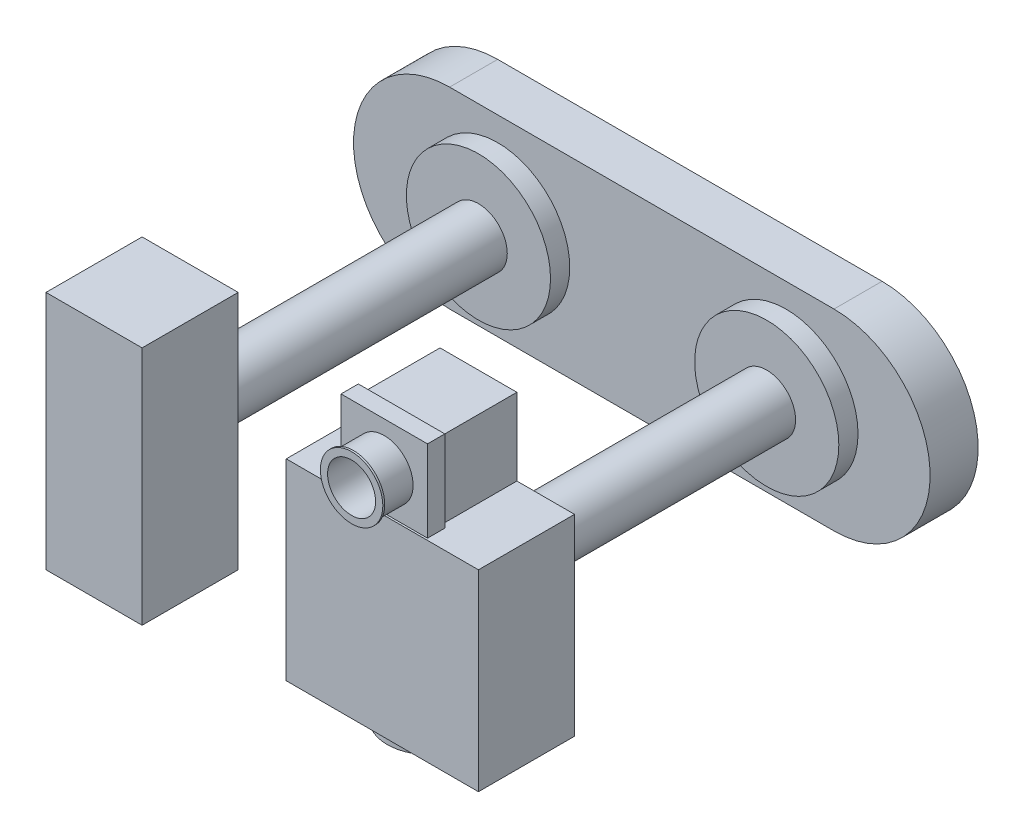
ISO-10303-21;
HEADER;
FILE_DESCRIPTION(('STEP AP214'),'2;1');
FILE_NAME('part.step','',(''),(''),'','','');
FILE_SCHEMA(('AUTOMOTIVE_DESIGN { 1 0 10303 214 1 1 1 1 }'));
ENDSEC;
DATA;
#1=APPLICATION_CONTEXT('core data for automotive mechanical design processes');
#2=APPLICATION_PROTOCOL_DEFINITION('international standard','automotive_design',2000,#1);
#3=PRODUCT_CONTEXT('',#1,'mechanical');
#4=PRODUCT('Part','Part','',(#3));
#5=PRODUCT_RELATED_PRODUCT_CATEGORY('part','',(#4));
#6=PRODUCT_DEFINITION_FORMATION('','',#4);
#7=PRODUCT_DEFINITION_CONTEXT('part definition',#1,'design');
#8=PRODUCT_DEFINITION('design','',#6,#7);
#9=PRODUCT_DEFINITION_SHAPE('','',#8);
#10=(LENGTH_UNIT() NAMED_UNIT(*) SI_UNIT(.MILLI.,.METRE.));
#11=(NAMED_UNIT(*) PLANE_ANGLE_UNIT() SI_UNIT($,.RADIAN.));
#12=(NAMED_UNIT(*) SI_UNIT($,.STERADIAN.) SOLID_ANGLE_UNIT());
#13=UNCERTAINTY_MEASURE_WITH_UNIT(LENGTH_MEASURE(1.E-05),#10,'distance_accuracy_value','');
#14=(GEOMETRIC_REPRESENTATION_CONTEXT(3) GLOBAL_UNCERTAINTY_ASSIGNED_CONTEXT((#13)) GLOBAL_UNIT_ASSIGNED_CONTEXT((#10,
#11,#12)) REPRESENTATION_CONTEXT('',''));
#15=CARTESIAN_POINT('',(0.,0.,0.));
#16=DIRECTION('',(0.,0.,1.));
#17=DIRECTION('',(1.,0.,0.));
#18=AXIS2_PLACEMENT_3D('',#15,#16,#17);
#19=CARTESIAN_POINT('',(75.,50.,235.));
#20=DIRECTION('',(0.,-1.,0.));
#21=DIRECTION('',(0.,0.,-1.));
#22=AXIS2_PLACEMENT_3D('',#19,#20,#21);
#23=PLANE('',#22);
#24=DIRECTION('',(0.,0.,-1.));
#25=VECTOR('',#24,1.);
#26=CARTESIAN_POINT('',(52.5,50.,234.));
#27=LINE('',#26,#25);
#28=CARTESIAN_POINT('',(52.5,50.,234.));
#29=VERTEX_POINT('',#28);
#30=CARTESIAN_POINT('',(52.5,50.,225.));
#31=VERTEX_POINT('',#30);
#32=EDGE_CURVE('E11',#29,#31,#27,.T.);
#33=ORIENTED_EDGE('',*,*,#32,.T.);
#34=DIRECTION('',(1.,0.,0.));
#35=VECTOR('',#34,1.);
#36=CARTESIAN_POINT('',(75.,50.,225.));
#37=LINE('',#36,#35);
#38=CARTESIAN_POINT('',(55.,50.,225.));
#39=VERTEX_POINT('',#38);
#40=EDGE_CURVE('E24',#31,#39,#37,.T.);
#41=ORIENTED_EDGE('',*,*,#40,.T.);
#42=DIRECTION('',(0.,0.,-1.));
#43=VECTOR('',#42,1.);
#44=CARTESIAN_POINT('',(55.,50.,225.));
#45=LINE('',#44,#43);
#46=CARTESIAN_POINT('',(55.,50.,185.));
#47=VERTEX_POINT('',#46);
#48=EDGE_CURVE('E352',#39,#47,#45,.T.);
#49=ORIENTED_EDGE('',*,*,#48,.T.);
#50=DIRECTION('',(-1.,0.,0.));
#51=VECTOR('',#50,1.);
#52=CARTESIAN_POINT('',(75.,50.,185.));
#53=LINE('',#52,#51);
#54=CARTESIAN_POINT('',(25.,50.,185.));
#55=VERTEX_POINT('',#54);
#56=EDGE_CURVE('E350',#47,#55,#53,.T.);
#57=ORIENTED_EDGE('',*,*,#56,.T.);
#58=DIRECTION('',(0.,0.,-1.));
#59=VECTOR('',#58,1.);
#60=CARTESIAN_POINT('',(25.,50.,235.));
#61=LINE('',#60,#59);
#62=CARTESIAN_POINT('',(25.,50.,235.));
#63=VERTEX_POINT('',#62);
#64=EDGE_CURVE('E347',#63,#55,#61,.T.);
#65=ORIENTED_EDGE('',*,*,#64,.F.);
#66=DIRECTION('',(-1.,0.,0.));
#67=VECTOR('',#66,1.);
#68=CARTESIAN_POINT('',(75.,50.,235.));
#69=LINE('',#68,#67);
#70=CARTESIAN_POINT('',(125.,50.,235.));
#71=VERTEX_POINT('',#70);
#72=EDGE_CURVE('E344',#71,#63,#69,.T.);
#73=ORIENTED_EDGE('',*,*,#72,.F.);
#74=DIRECTION('',(0.,0.,-1.));
#75=VECTOR('',#74,1.);
#76=CARTESIAN_POINT('',(125.,50.,235.));
#77=LINE('',#76,#75);
#78=CARTESIAN_POINT('',(125.,50.,185.));
#79=VERTEX_POINT('',#78);
#80=EDGE_CURVE('E342',#71,#79,#77,.T.);
#81=ORIENTED_EDGE('',*,*,#80,.T.);
#82=CARTESIAN_POINT('',(95.,50.,185.));
#83=VERTEX_POINT('',#82);
#84=EDGE_CURVE('E341',#79,#83,#53,.T.);
#85=ORIENTED_EDGE('',*,*,#84,.T.);
#86=DIRECTION('',(0.,0.,-1.));
#87=VECTOR('',#86,1.);
#88=CARTESIAN_POINT('',(95.,50.,225.));
#89=LINE('',#88,#87);
#90=CARTESIAN_POINT('',(95.,50.,225.));
#91=VERTEX_POINT('',#90);
#92=EDGE_CURVE('E338',#91,#83,#89,.T.);
#93=ORIENTED_EDGE('',*,*,#92,.F.);
#94=CARTESIAN_POINT('',(97.5,50.,225.));
#95=VERTEX_POINT('',#94);
#96=EDGE_CURVE('E337',#91,#95,#37,.T.);
#97=ORIENTED_EDGE('',*,*,#96,.T.);
#98=DIRECTION('',(0.,0.,-1.));
#99=VECTOR('',#98,1.);
#100=CARTESIAN_POINT('',(97.5,50.,234.));
#101=LINE('',#100,#99);
#102=CARTESIAN_POINT('',(97.5,50.,234.));
#103=VERTEX_POINT('',#102);
#104=EDGE_CURVE('E335',#103,#95,#101,.T.);
#105=ORIENTED_EDGE('',*,*,#104,.F.);
#106=DIRECTION('',(1.,0.,0.));
#107=VECTOR('',#106,1.);
#108=CARTESIAN_POINT('',(75.,50.,234.));
#109=LINE('',#108,#107);
#110=EDGE_CURVE('E174',#29,#103,#109,.T.);
#111=ORIENTED_EDGE('',*,*,#110,.F.);
#112=EDGE_LOOP('',(#33,#41,#49,#57,#65,#73,#81,#85,#93,#97,#105,#111));
#113=FACE_BOUND('',#112,.T.);
#114=ADVANCED_FACE('F17',(#113),#23,.F.);
#115=CARTESIAN_POINT('',(0.,50.,25.));
#116=DIRECTION('',(0.,1.,0.));
#117=DIRECTION('',(0.,0.,1.));
#118=AXIS2_PLACEMENT_3D('',#115,#116,#117);
#119=PLANE('',#118);
#120=DIRECTION('',(1.,0.,0.));
#121=VECTOR('',#120,1.);
#122=CARTESIAN_POINT('',(0.,50.,0.));
#123=LINE('',#122,#121);
#124=CARTESIAN_POINT('',(-100.,50.,0.));
#125=VERTEX_POINT('',#124);
#126=CARTESIAN_POINT('',(100.,50.,0.));
#127=VERTEX_POINT('',#126);
#128=EDGE_CURVE('E331',#125,#127,#123,.T.);
#129=ORIENTED_EDGE('',*,*,#128,.F.);
#130=DIRECTION('',(0.,0.,-1.));
#131=VECTOR('',#130,1.);
#132=CARTESIAN_POINT('',(-100.,50.,25.));
#133=LINE('',#132,#131);
#134=CARTESIAN_POINT('',(-100.,50.,25.));
#135=VERTEX_POINT('',#134);
#136=EDGE_CURVE('E328',#135,#125,#133,.T.);
#137=ORIENTED_EDGE('',*,*,#136,.F.);
#138=DIRECTION('',(1.,0.,0.));
#139=VECTOR('',#138,1.);
#140=CARTESIAN_POINT('',(0.,50.,25.));
#141=LINE('',#140,#139);
#142=CARTESIAN_POINT('',(100.,50.,25.));
#143=VERTEX_POINT('',#142);
#144=EDGE_CURVE('E326',#135,#143,#141,.T.);
#145=ORIENTED_EDGE('',*,*,#144,.T.);
#146=DIRECTION('',(0.,0.,-1.));
#147=VECTOR('',#146,1.);
#148=CARTESIAN_POINT('',(100.,50.,25.));
#149=LINE('',#148,#147);
#150=EDGE_CURVE('E324',#143,#127,#149,.T.);
#151=ORIENTED_EDGE('',*,*,#150,.T.);
#152=EDGE_LOOP('',(#129,#137,#145,#151));
#153=FACE_BOUND('',#152,.T.);
#154=ADVANCED_FACE('F373',(#153),#119,.T.);
#155=CARTESIAN_POINT('',(-100.,0.,25.));
#156=DIRECTION('',(0.,0.,-1.));
#157=DIRECTION('',(-1.,0.,0.));
#158=AXIS2_PLACEMENT_3D('',#155,#156,#157);
#159=CYLINDRICAL_SURFACE('',#158,50.);
#160=CARTESIAN_POINT('',(-100.,0.,0.));
#161=DIRECTION('',(0.,0.,1.));
#162=DIRECTION('',(1.,0.,0.));
#163=AXIS2_PLACEMENT_3D('',#160,#161,#162);
#164=CIRCLE('',#163,50.);
#165=CARTESIAN_POINT('',(-100.,-50.,0.));
#166=VERTEX_POINT('',#165);
#167=EDGE_CURVE('E322',#125,#166,#164,.T.);
#168=ORIENTED_EDGE('',*,*,#167,.T.);
#169=DIRECTION('',(0.,0.,-1.));
#170=VECTOR('',#169,1.);
#171=CARTESIAN_POINT('',(-100.,-50.,25.));
#172=LINE('',#171,#170);
#173=CARTESIAN_POINT('',(-100.,-50.,25.));
#174=VERTEX_POINT('',#173);
#175=EDGE_CURVE('E319',#174,#166,#172,.T.);
#176=ORIENTED_EDGE('',*,*,#175,.F.);
#177=CARTESIAN_POINT('',(-100.,0.,25.));
#178=DIRECTION('',(0.,0.,1.));
#179=DIRECTION('',(1.,0.,0.));
#180=AXIS2_PLACEMENT_3D('',#177,#178,#179);
#181=CIRCLE('',#180,50.);
#182=EDGE_CURVE('E316',#135,#174,#181,.T.);
#183=ORIENTED_EDGE('',*,*,#182,.F.);
#184=ORIENTED_EDGE('',*,*,#136,.T.);
#185=EDGE_LOOP('',(#168,#176,#183,#184));
#186=FACE_BOUND('',#185,.T.);
#187=ADVANCED_FACE('F377',(#186),#159,.T.);
#188=CARTESIAN_POINT('',(0.,-50.,25.));
#189=DIRECTION('',(0.,1.,0.));
#190=DIRECTION('',(0.,0.,1.));
#191=AXIS2_PLACEMENT_3D('',#188,#189,#190);
#192=PLANE('',#191);
#193=DIRECTION('',(1.,0.,0.));
#194=VECTOR('',#193,1.);
#195=CARTESIAN_POINT('',(0.,-50.,0.));
#196=LINE('',#195,#194);
#197=CARTESIAN_POINT('',(100.,-50.,0.));
#198=VERTEX_POINT('',#197);
#199=EDGE_CURVE('E314',#166,#198,#196,.T.);
#200=ORIENTED_EDGE('',*,*,#199,.T.);
#201=DIRECTION('',(0.,0.,-1.));
#202=VECTOR('',#201,1.);
#203=CARTESIAN_POINT('',(100.,-50.,25.));
#204=LINE('',#203,#202);
#205=CARTESIAN_POINT('',(100.,-50.,25.));
#206=VERTEX_POINT('',#205);
#207=EDGE_CURVE('E311',#206,#198,#204,.T.);
#208=ORIENTED_EDGE('',*,*,#207,.F.);
#209=DIRECTION('',(1.,0.,0.));
#210=VECTOR('',#209,1.);
#211=CARTESIAN_POINT('',(0.,-50.,25.));
#212=LINE('',#211,#210);
#213=EDGE_CURVE('E308',#174,#206,#212,.T.);
#214=ORIENTED_EDGE('',*,*,#213,.F.);
#215=ORIENTED_EDGE('',*,*,#175,.T.);
#216=EDGE_LOOP('',(#200,#208,#214,#215));
#217=FACE_BOUND('',#216,.T.);
#218=ADVANCED_FACE('F382',(#217),#192,.F.);
#219=CARTESIAN_POINT('',(100.,0.,25.));
#220=DIRECTION('',(0.,0.,-1.));
#221=DIRECTION('',(-1.,0.,0.));
#222=AXIS2_PLACEMENT_3D('',#219,#220,#221);
#223=CYLINDRICAL_SURFACE('',#222,50.);
#224=CARTESIAN_POINT('',(100.,0.,0.));
#225=DIRECTION('',(0.,0.,1.));
#226=DIRECTION('',(1.,0.,0.));
#227=AXIS2_PLACEMENT_3D('',#224,#225,#226);
#228=CIRCLE('',#227,50.);
#229=EDGE_CURVE('E305',#198,#127,#228,.T.);
#230=ORIENTED_EDGE('',*,*,#229,.T.);
#231=ORIENTED_EDGE('',*,*,#150,.F.);
#232=CARTESIAN_POINT('',(100.,0.,25.));
#233=DIRECTION('',(0.,0.,1.));
#234=DIRECTION('',(1.,0.,0.));
#235=AXIS2_PLACEMENT_3D('',#232,#233,#234);
#236=CIRCLE('',#235,50.);
#237=EDGE_CURVE('E302',#206,#143,#236,.T.);
#238=ORIENTED_EDGE('',*,*,#237,.F.);
#239=ORIENTED_EDGE('',*,*,#207,.T.);
#240=EDGE_LOOP('',(#230,#231,#238,#239));
#241=FACE_BOUND('',#240,.T.);
#242=ADVANCED_FACE('F388',(#241),#223,.T.);
#243=CARTESIAN_POINT('',(0.,0.,25.));
#244=DIRECTION('',(0.,0.,1.));
#245=DIRECTION('',(1.,0.,0.));
#246=AXIS2_PLACEMENT_3D('',#243,#244,#245);
#247=PLANE('',#246);
#248=CARTESIAN_POINT('',(75.,0.,25.));
#249=DIRECTION('',(0.,0.,1.));
#250=DIRECTION('',(1.,0.,0.));
#251=AXIS2_PLACEMENT_3D('',#248,#249,#250);
#252=CIRCLE('',#251,37.5);
#253=CARTESIAN_POINT('',(112.5,0.,25.));
#254=VERTEX_POINT('',#253);
#255=EDGE_CURVE('E299',#254,#254,#252,.T.);
#256=ORIENTED_EDGE('',*,*,#255,.F.);
#257=EDGE_LOOP('',(#256));
#258=FACE_BOUND('',#257,.T.);
#259=CARTESIAN_POINT('',(-75.,0.,25.));
#260=DIRECTION('',(0.,0.,1.));
#261=DIRECTION('',(1.,0.,0.));
#262=AXIS2_PLACEMENT_3D('',#259,#260,#261);
#263=CIRCLE('',#262,37.5);
#264=CARTESIAN_POINT('',(-37.5,0.,25.));
#265=VERTEX_POINT('',#264);
#266=EDGE_CURVE('E296',#265,#265,#263,.T.);
#267=ORIENTED_EDGE('',*,*,#266,.F.);
#268=EDGE_LOOP('',(#267));
#269=FACE_BOUND('',#268,.T.);
#270=ORIENTED_EDGE('',*,*,#144,.F.);
#271=ORIENTED_EDGE('',*,*,#182,.T.);
#272=ORIENTED_EDGE('',*,*,#213,.T.);
#273=ORIENTED_EDGE('',*,*,#237,.T.);
#274=EDGE_LOOP('',(#270,#271,#272,#273));
#275=FACE_BOUND('',#274,.T.);
#276=ADVANCED_FACE('F392',(#258,#269,#275),#247,.T.);
#277=CARTESIAN_POINT('',(0.,0.,0.));
#278=DIRECTION('',(0.,0.,1.));
#279=DIRECTION('',(1.,0.,0.));
#280=AXIS2_PLACEMENT_3D('',#277,#278,#279);
#281=PLANE('',#280);
#282=ORIENTED_EDGE('',*,*,#128,.T.);
#283=ORIENTED_EDGE('',*,*,#229,.F.);
#284=ORIENTED_EDGE('',*,*,#199,.F.);
#285=ORIENTED_EDGE('',*,*,#167,.F.);
#286=EDGE_LOOP('',(#282,#283,#284,#285));
#287=FACE_BOUND('',#286,.T.);
#288=ADVANCED_FACE('F396',(#287),#281,.F.);
#289=CARTESIAN_POINT('',(-75.,0.,35.));
#290=DIRECTION('',(0.,0.,-1.));
#291=DIRECTION('',(-1.,0.,0.));
#292=AXIS2_PLACEMENT_3D('',#289,#290,#291);
#293=CYLINDRICAL_SURFACE('',#292,37.5);
#294=CARTESIAN_POINT('',(-75.,0.,35.));
#295=DIRECTION('',(0.,0.,1.));
#296=DIRECTION('',(1.,0.,0.));
#297=AXIS2_PLACEMENT_3D('',#294,#295,#296);
#298=CIRCLE('',#297,37.5);
#299=CARTESIAN_POINT('',(-37.5,0.,35.));
#300=VERTEX_POINT('',#299);
#301=EDGE_CURVE('E293',#300,#300,#298,.T.);
#302=ORIENTED_EDGE('',*,*,#301,.F.);
#303=EDGE_LOOP('',(#302));
#304=FACE_BOUND('',#303,.T.);
#305=ORIENTED_EDGE('',*,*,#266,.T.);
#306=EDGE_LOOP('',(#305));
#307=FACE_BOUND('',#306,.T.);
#308=ADVANCED_FACE('F400',(#304,#307),#293,.T.);
#309=CARTESIAN_POINT('',(0.,0.,35.));
#310=DIRECTION('',(0.,0.,1.));
#311=DIRECTION('',(1.,0.,0.));
#312=AXIS2_PLACEMENT_3D('',#309,#310,#311);
#313=PLANE('',#312);
#314=CARTESIAN_POINT('',(-75.,0.,35.));
#315=DIRECTION('',(0.,0.,1.));
#316=DIRECTION('',(1.,0.,0.));
#317=AXIS2_PLACEMENT_3D('',#314,#315,#316);
#318=CIRCLE('',#317,15.);
#319=CARTESIAN_POINT('',(-60.,0.,35.));
#320=VERTEX_POINT('',#319);
#321=EDGE_CURVE('E290',#320,#320,#318,.T.);
#322=ORIENTED_EDGE('',*,*,#321,.F.);
#323=EDGE_LOOP('',(#322));
#324=FACE_BOUND('',#323,.T.);
#325=ORIENTED_EDGE('',*,*,#301,.T.);
#326=EDGE_LOOP('',(#325));
#327=FACE_BOUND('',#326,.T.);
#328=ADVANCED_FACE('F404',(#324,#327),#313,.T.);
#329=CARTESIAN_POINT('',(75.,0.,35.));
#330=DIRECTION('',(0.,0.,-1.));
#331=DIRECTION('',(-1.,0.,0.));
#332=AXIS2_PLACEMENT_3D('',#329,#330,#331);
#333=CYLINDRICAL_SURFACE('',#332,37.5);
#334=CARTESIAN_POINT('',(75.,0.,35.));
#335=DIRECTION('',(0.,0.,1.));
#336=DIRECTION('',(1.,0.,0.));
#337=AXIS2_PLACEMENT_3D('',#334,#335,#336);
#338=CIRCLE('',#337,37.5);
#339=CARTESIAN_POINT('',(112.5,0.,35.));
#340=VERTEX_POINT('',#339);
#341=EDGE_CURVE('E287',#340,#340,#338,.T.);
#342=ORIENTED_EDGE('',*,*,#341,.F.);
#343=EDGE_LOOP('',(#342));
#344=FACE_BOUND('',#343,.T.);
#345=ORIENTED_EDGE('',*,*,#255,.T.);
#346=EDGE_LOOP('',(#345));
#347=FACE_BOUND('',#346,.T.);
#348=ADVANCED_FACE('F408',(#344,#347),#333,.T.);
#349=CARTESIAN_POINT('',(0.,0.,35.));
#350=DIRECTION('',(0.,0.,1.));
#351=DIRECTION('',(1.,0.,0.));
#352=AXIS2_PLACEMENT_3D('',#349,#350,#351);
#353=PLANE('',#352);
#354=CARTESIAN_POINT('',(75.,0.,35.));
#355=DIRECTION('',(0.,0.,1.));
#356=DIRECTION('',(1.,0.,0.));
#357=AXIS2_PLACEMENT_3D('',#354,#355,#356);
#358=CIRCLE('',#357,15.);
#359=CARTESIAN_POINT('',(90.,0.,35.));
#360=VERTEX_POINT('',#359);
#361=EDGE_CURVE('E284',#360,#360,#358,.T.);
#362=ORIENTED_EDGE('',*,*,#361,.F.);
#363=EDGE_LOOP('',(#362));
#364=FACE_BOUND('',#363,.T.);
#365=ORIENTED_EDGE('',*,*,#341,.T.);
#366=EDGE_LOOP('',(#365));
#367=FACE_BOUND('',#366,.T.);
#368=ADVANCED_FACE('F412',(#364,#367),#353,.T.);
#369=CARTESIAN_POINT('',(75.,0.,185.));
#370=DIRECTION('',(0.,0.,-1.));
#371=DIRECTION('',(-1.,0.,0.));
#372=AXIS2_PLACEMENT_3D('',#369,#370,#371);
#373=CYLINDRICAL_SURFACE('',#372,15.);
#374=CARTESIAN_POINT('',(75.,0.,185.));
#375=DIRECTION('',(0.,0.,1.));
#376=DIRECTION('',(1.,0.,0.));
#377=AXIS2_PLACEMENT_3D('',#374,#375,#376);
#378=CIRCLE('',#377,15.);
#379=CARTESIAN_POINT('',(90.,0.,185.));
#380=VERTEX_POINT('',#379);
#381=EDGE_CURVE('E281',#380,#380,#378,.T.);
#382=ORIENTED_EDGE('',*,*,#381,.F.);
#383=EDGE_LOOP('',(#382));
#384=FACE_BOUND('',#383,.T.);
#385=ORIENTED_EDGE('',*,*,#361,.T.);
#386=EDGE_LOOP('',(#385));
#387=FACE_BOUND('',#386,.T.);
#388=ADVANCED_FACE('F416',(#384,#387),#373,.T.);
#389=CARTESIAN_POINT('',(-75.,0.,185.));
#390=DIRECTION('',(0.,0.,-1.));
#391=DIRECTION('',(-1.,0.,0.));
#392=AXIS2_PLACEMENT_3D('',#389,#390,#391);
#393=CYLINDRICAL_SURFACE('',#392,15.);
#394=CARTESIAN_POINT('',(-75.,0.,185.));
#395=DIRECTION('',(0.,0.,1.));
#396=DIRECTION('',(1.,0.,0.));
#397=AXIS2_PLACEMENT_3D('',#394,#395,#396);
#398=CIRCLE('',#397,15.);
#399=CARTESIAN_POINT('',(-60.,0.,185.));
#400=VERTEX_POINT('',#399);
#401=EDGE_CURVE('E278',#400,#400,#398,.T.);
#402=ORIENTED_EDGE('',*,*,#401,.F.);
#403=EDGE_LOOP('',(#402));
#404=FACE_BOUND('',#403,.T.);
#405=ORIENTED_EDGE('',*,*,#321,.T.);
#406=EDGE_LOOP('',(#405));
#407=FACE_BOUND('',#406,.T.);
#408=ADVANCED_FACE('F420',(#404,#407),#393,.T.);
#409=CARTESIAN_POINT('',(-100.,0.,235.));
#410=DIRECTION('',(-1.,0.,0.));
#411=DIRECTION('',(0.,0.,1.));
#412=AXIS2_PLACEMENT_3D('',#409,#410,#411);
#413=PLANE('',#412);
#414=DIRECTION('',(0.,1.,0.));
#415=VECTOR('',#414,1.);
#416=CARTESIAN_POINT('',(-100.,0.,185.));
#417=LINE('',#416,#415);
#418=CARTESIAN_POINT('',(-100.,-62.5,185.));
#419=VERTEX_POINT('',#418);
#420=CARTESIAN_POINT('',(-100.,62.5,185.));
#421=VERTEX_POINT('',#420);
#422=EDGE_CURVE('E275',#419,#421,#417,.T.);
#423=ORIENTED_EDGE('',*,*,#422,.F.);
#424=DIRECTION('',(0.,0.,-1.));
#425=VECTOR('',#424,1.);
#426=CARTESIAN_POINT('',(-100.,-62.5,235.));
#427=LINE('',#426,#425);
#428=CARTESIAN_POINT('',(-100.,-62.5,235.));
#429=VERTEX_POINT('',#428);
#430=EDGE_CURVE('E272',#429,#419,#427,.T.);
#431=ORIENTED_EDGE('',*,*,#430,.F.);
#432=DIRECTION('',(0.,1.,0.));
#433=VECTOR('',#432,1.);
#434=CARTESIAN_POINT('',(-100.,0.,235.));
#435=LINE('',#434,#433);
#436=CARTESIAN_POINT('',(-100.,62.5,235.));
#437=VERTEX_POINT('',#436);
#438=EDGE_CURVE('E270',#429,#437,#435,.T.);
#439=ORIENTED_EDGE('',*,*,#438,.T.);
#440=DIRECTION('',(0.,0.,-1.));
#441=VECTOR('',#440,1.);
#442=CARTESIAN_POINT('',(-100.,62.5,235.));
#443=LINE('',#442,#441);
#444=EDGE_CURVE('E268',#437,#421,#443,.T.);
#445=ORIENTED_EDGE('',*,*,#444,.T.);
#446=EDGE_LOOP('',(#423,#431,#439,#445));
#447=FACE_BOUND('',#446,.T.);
#448=ADVANCED_FACE('F424',(#447),#413,.T.);
#449=CARTESIAN_POINT('',(-75.,-62.5,235.));
#450=DIRECTION('',(0.,1.,0.));
#451=DIRECTION('',(0.,0.,1.));
#452=AXIS2_PLACEMENT_3D('',#449,#450,#451);
#453=PLANE('',#452);
#454=CARTESIAN_POINT('',(-75.,-62.5,210.));
#455=DIRECTION('',(0.,-1.,0.));
#456=DIRECTION('',(0.,0.,-1.));
#457=AXIS2_PLACEMENT_3D('',#454,#455,#456);
#458=CIRCLE('',#457,15.);
#459=CARTESIAN_POINT('',(-75.,-62.5,195.));
#460=VERTEX_POINT('',#459);
#461=EDGE_CURVE('E265',#460,#460,#458,.T.);
#462=ORIENTED_EDGE('',*,*,#461,.F.);
#463=EDGE_LOOP('',(#462));
#464=FACE_BOUND('',#463,.T.);
#465=DIRECTION('',(1.,0.,0.));
#466=VECTOR('',#465,1.);
#467=CARTESIAN_POINT('',(-75.,-62.5,185.));
#468=LINE('',#467,#466);
#469=CARTESIAN_POINT('',(-50.,-62.5,185.));
#470=VERTEX_POINT('',#469);
#471=EDGE_CURVE('E263',#419,#470,#468,.T.);
#472=ORIENTED_EDGE('',*,*,#471,.T.);
#473=DIRECTION('',(0.,0.,-1.));
#474=VECTOR('',#473,1.);
#475=CARTESIAN_POINT('',(-50.,-62.5,235.));
#476=LINE('',#475,#474);
#477=CARTESIAN_POINT('',(-50.,-62.5,235.));
#478=VERTEX_POINT('',#477);
#479=EDGE_CURVE('E260',#478,#470,#476,.T.);
#480=ORIENTED_EDGE('',*,*,#479,.F.);
#481=DIRECTION('',(1.,0.,0.));
#482=VECTOR('',#481,1.);
#483=CARTESIAN_POINT('',(-75.,-62.5,235.));
#484=LINE('',#483,#482);
#485=EDGE_CURVE('E257',#429,#478,#484,.T.);
#486=ORIENTED_EDGE('',*,*,#485,.F.);
#487=ORIENTED_EDGE('',*,*,#430,.T.);
#488=EDGE_LOOP('',(#472,#480,#486,#487));
#489=FACE_BOUND('',#488,.T.);
#490=ADVANCED_FACE('F428',(#464,#489),#453,.F.);
#491=CARTESIAN_POINT('',(-50.,0.,235.));
#492=DIRECTION('',(-1.,0.,0.));
#493=DIRECTION('',(0.,0.,1.));
#494=AXIS2_PLACEMENT_3D('',#491,#492,#493);
#495=PLANE('',#494);
#496=DIRECTION('',(0.,1.,0.));
#497=VECTOR('',#496,1.);
#498=CARTESIAN_POINT('',(-50.,0.,185.));
#499=LINE('',#498,#497);
#500=CARTESIAN_POINT('',(-50.,62.5,185.));
#501=VERTEX_POINT('',#500);
#502=EDGE_CURVE('E255',#470,#501,#499,.T.);
#503=ORIENTED_EDGE('',*,*,#502,.T.);
#504=DIRECTION('',(0.,0.,-1.));
#505=VECTOR('',#504,1.);
#506=CARTESIAN_POINT('',(-50.,62.5,235.));
#507=LINE('',#506,#505);
#508=CARTESIAN_POINT('',(-50.,62.5,235.));
#509=VERTEX_POINT('',#508);
#510=EDGE_CURVE('E252',#509,#501,#507,.T.);
#511=ORIENTED_EDGE('',*,*,#510,.F.);
#512=DIRECTION('',(0.,1.,0.));
#513=VECTOR('',#512,1.);
#514=CARTESIAN_POINT('',(-50.,0.,235.));
#515=LINE('',#514,#513);
#516=EDGE_CURVE('E249',#478,#509,#515,.T.);
#517=ORIENTED_EDGE('',*,*,#516,.F.);
#518=ORIENTED_EDGE('',*,*,#479,.T.);
#519=EDGE_LOOP('',(#503,#511,#517,#518));
#520=FACE_BOUND('',#519,.T.);
#521=ADVANCED_FACE('F432',(#520),#495,.F.);
#522=CARTESIAN_POINT('',(-75.,62.5,235.));
#523=DIRECTION('',(0.,1.,0.));
#524=DIRECTION('',(-1.,0.,0.));
#525=AXIS2_PLACEMENT_3D('',#522,#523,#524);
#526=PLANE('',#525);
#527=DIRECTION('',(1.,0.,0.));
#528=VECTOR('',#527,1.);
#529=CARTESIAN_POINT('',(-75.,62.5,185.));
#530=LINE('',#529,#528);
#531=EDGE_CURVE('E246',#421,#501,#530,.T.);
#532=ORIENTED_EDGE('',*,*,#531,.F.);
#533=ORIENTED_EDGE('',*,*,#444,.F.);
#534=DIRECTION('',(1.,0.,0.));
#535=VECTOR('',#534,1.);
#536=CARTESIAN_POINT('',(-75.,62.5,235.));
#537=LINE('',#536,#535);
#538=EDGE_CURVE('E243',#437,#509,#537,.T.);
#539=ORIENTED_EDGE('',*,*,#538,.T.);
#540=ORIENTED_EDGE('',*,*,#510,.T.);
#541=EDGE_LOOP('',(#532,#533,#539,#540));
#542=FACE_BOUND('',#541,.T.);
#543=ADVANCED_FACE('F436',(#542),#526,.T.);
#544=CARTESIAN_POINT('',(-75.,0.,235.));
#545=DIRECTION('',(0.,0.,1.));
#546=DIRECTION('',(1.,0.,0.));
#547=AXIS2_PLACEMENT_3D('',#544,#545,#546);
#548=PLANE('',#547);
#549=ORIENTED_EDGE('',*,*,#438,.F.);
#550=ORIENTED_EDGE('',*,*,#485,.T.);
#551=ORIENTED_EDGE('',*,*,#516,.T.);
#552=ORIENTED_EDGE('',*,*,#538,.F.);
#553=EDGE_LOOP('',(#549,#550,#551,#552));
#554=FACE_BOUND('',#553,.T.);
#555=ADVANCED_FACE('F440',(#554),#548,.T.);
#556=CARTESIAN_POINT('',(-75.,0.,185.));
#557=DIRECTION('',(0.,0.,1.));
#558=DIRECTION('',(1.,0.,0.));
#559=AXIS2_PLACEMENT_3D('',#556,#557,#558);
#560=PLANE('',#559);
#561=ORIENTED_EDGE('',*,*,#401,.T.);
#562=EDGE_LOOP('',(#561));
#563=FACE_BOUND('',#562,.T.);
#564=ORIENTED_EDGE('',*,*,#422,.T.);
#565=ORIENTED_EDGE('',*,*,#531,.T.);
#566=ORIENTED_EDGE('',*,*,#502,.F.);
#567=ORIENTED_EDGE('',*,*,#471,.F.);
#568=EDGE_LOOP('',(#564,#565,#566,#567));
#569=FACE_BOUND('',#568,.T.);
#570=ADVANCED_FACE('F444',(#563,#569),#560,.F.);
#571=CARTESIAN_POINT('',(-75.,-72.5,210.));
#572=DIRECTION('',(0.,1.,0.));
#573=DIRECTION('',(0.,0.,1.));
#574=AXIS2_PLACEMENT_3D('',#571,#572,#573);
#575=CYLINDRICAL_SURFACE('',#574,15.);
#576=CARTESIAN_POINT('',(-75.,-72.5,210.));
#577=DIRECTION('',(0.,-1.,0.));
#578=DIRECTION('',(0.,0.,-1.));
#579=AXIS2_PLACEMENT_3D('',#576,#577,#578);
#580=CIRCLE('',#579,15.);
#581=CARTESIAN_POINT('',(-75.,-72.5,195.));
#582=VERTEX_POINT('',#581);
#583=EDGE_CURVE('E240',#582,#582,#580,.T.);
#584=ORIENTED_EDGE('',*,*,#583,.F.);
#585=EDGE_LOOP('',(#584));
#586=FACE_BOUND('',#585,.T.);
#587=ORIENTED_EDGE('',*,*,#461,.T.);
#588=EDGE_LOOP('',(#587));
#589=FACE_BOUND('',#588,.T.);
#590=ADVANCED_FACE('F448',(#586,#589),#575,.T.);
#591=CARTESIAN_POINT('',(-75.,-72.5,210.));
#592=DIRECTION('',(0.,-1.,0.));
#593=DIRECTION('',(1.,0.,0.));
#594=AXIS2_PLACEMENT_3D('',#591,#592,#593);
#595=PLANE('',#594);
#596=ORIENTED_EDGE('',*,*,#583,.T.);
#597=EDGE_LOOP('',(#596));
#598=FACE_BOUND('',#597,.T.);
#599=ADVANCED_FACE('F452',(#598),#595,.T.);
#600=CARTESIAN_POINT('',(75.,-50.,235.));
#601=DIRECTION('',(0.,-1.,0.));
#602=DIRECTION('',(1.,0.,0.));
#603=AXIS2_PLACEMENT_3D('',#600,#601,#602);
#604=PLANE('',#603);
#605=CARTESIAN_POINT('',(75.,-50.,210.));
#606=DIRECTION('',(0.,-1.,0.));
#607=DIRECTION('',(1.,0.,0.));
#608=AXIS2_PLACEMENT_3D('',#605,#606,#607);
#609=CIRCLE('',#608,22.5);
#610=CARTESIAN_POINT('',(97.5,-50.,210.));
#611=VERTEX_POINT('',#610);
#612=EDGE_CURVE('E237',#611,#611,#609,.T.);
#613=ORIENTED_EDGE('',*,*,#612,.F.);
#614=EDGE_LOOP('',(#613));
#615=FACE_BOUND('',#614,.T.);
#616=DIRECTION('',(-1.,0.,0.));
#617=VECTOR('',#616,1.);
#618=CARTESIAN_POINT('',(75.,-50.,185.));
#619=LINE('',#618,#617);
#620=CARTESIAN_POINT('',(125.,-50.,185.));
#621=VERTEX_POINT('',#620);
#622=CARTESIAN_POINT('',(25.,-50.,185.));
#623=VERTEX_POINT('',#622);
#624=EDGE_CURVE('E234',#621,#623,#619,.T.);
#625=ORIENTED_EDGE('',*,*,#624,.F.);
#626=DIRECTION('',(0.,0.,-1.));
#627=VECTOR('',#626,1.);
#628=CARTESIAN_POINT('',(125.,-50.,235.));
#629=LINE('',#628,#627);
#630=CARTESIAN_POINT('',(125.,-50.,235.));
#631=VERTEX_POINT('',#630);
#632=EDGE_CURVE('E231',#631,#621,#629,.T.);
#633=ORIENTED_EDGE('',*,*,#632,.F.);
#634=DIRECTION('',(-1.,0.,0.));
#635=VECTOR('',#634,1.);
#636=CARTESIAN_POINT('',(75.,-50.,235.));
#637=LINE('',#636,#635);
#638=CARTESIAN_POINT('',(25.,-50.,235.));
#639=VERTEX_POINT('',#638);
#640=EDGE_CURVE('E229',#631,#639,#637,.T.);
#641=ORIENTED_EDGE('',*,*,#640,.T.);
#642=DIRECTION('',(0.,0.,-1.));
#643=VECTOR('',#642,1.);
#644=CARTESIAN_POINT('',(25.,-50.,235.));
#645=LINE('',#644,#643);
#646=EDGE_CURVE('E227',#639,#623,#645,.T.);
#647=ORIENTED_EDGE('',*,*,#646,.T.);
#648=EDGE_LOOP('',(#625,#633,#641,#647));
#649=FACE_BOUND('',#648,.T.);
#650=ADVANCED_FACE('F456',(#615,#649),#604,.T.);
#651=CARTESIAN_POINT('',(125.,0.,235.));
#652=DIRECTION('',(-1.,0.,0.));
#653=DIRECTION('',(0.,0.,1.));
#654=AXIS2_PLACEMENT_3D('',#651,#652,#653);
#655=PLANE('',#654);
#656=DIRECTION('',(0.,1.,0.));
#657=VECTOR('',#656,1.);
#658=CARTESIAN_POINT('',(125.,0.,185.));
#659=LINE('',#658,#657);
#660=EDGE_CURVE('E224',#621,#79,#659,.T.);
#661=ORIENTED_EDGE('',*,*,#660,.T.);
#662=ORIENTED_EDGE('',*,*,#80,.F.);
#663=DIRECTION('',(0.,1.,0.));
#664=VECTOR('',#663,1.);
#665=CARTESIAN_POINT('',(125.,0.,235.));
#666=LINE('',#665,#664);
#667=EDGE_CURVE('E221',#631,#71,#666,.T.);
#668=ORIENTED_EDGE('',*,*,#667,.F.);
#669=ORIENTED_EDGE('',*,*,#632,.T.);
#670=EDGE_LOOP('',(#661,#662,#668,#669));
#671=FACE_BOUND('',#670,.T.);
#672=ADVANCED_FACE('F460',(#671),#655,.F.);
#673=CARTESIAN_POINT('',(25.,0.,235.));
#674=DIRECTION('',(-1.,0.,0.));
#675=DIRECTION('',(0.,-1.,0.));
#676=AXIS2_PLACEMENT_3D('',#673,#674,#675);
#677=PLANE('',#676);
#678=DIRECTION('',(0.,1.,0.));
#679=VECTOR('',#678,1.);
#680=CARTESIAN_POINT('',(25.,0.,185.));
#681=LINE('',#680,#679);
#682=EDGE_CURVE('E218',#623,#55,#681,.T.);
#683=ORIENTED_EDGE('',*,*,#682,.F.);
#684=ORIENTED_EDGE('',*,*,#646,.F.);
#685=DIRECTION('',(0.,1.,0.));
#686=VECTOR('',#685,1.);
#687=CARTESIAN_POINT('',(25.,0.,235.));
#688=LINE('',#687,#686);
#689=EDGE_CURVE('E215',#639,#63,#688,.T.);
#690=ORIENTED_EDGE('',*,*,#689,.T.);
#691=ORIENTED_EDGE('',*,*,#64,.T.);
#692=EDGE_LOOP('',(#683,#684,#690,#691));
#693=FACE_BOUND('',#692,.T.);
#694=ADVANCED_FACE('F464',(#693),#677,.T.);
#695=CARTESIAN_POINT('',(75.,0.,235.));
#696=DIRECTION('',(0.,0.,1.));
#697=DIRECTION('',(1.,0.,0.));
#698=AXIS2_PLACEMENT_3D('',#695,#696,#697);
#699=PLANE('',#698);
#700=ORIENTED_EDGE('',*,*,#640,.F.);
#701=ORIENTED_EDGE('',*,*,#667,.T.);
#702=ORIENTED_EDGE('',*,*,#72,.T.);
#703=ORIENTED_EDGE('',*,*,#689,.F.);
#704=EDGE_LOOP('',(#700,#701,#702,#703));
#705=FACE_BOUND('',#704,.T.);
#706=ADVANCED_FACE('F468',(#705),#699,.T.);
#707=CARTESIAN_POINT('',(75.,0.,185.));
#708=DIRECTION('',(0.,0.,1.));
#709=DIRECTION('',(1.,0.,0.));
#710=AXIS2_PLACEMENT_3D('',#707,#708,#709);
#711=PLANE('',#710);
#712=ORIENTED_EDGE('',*,*,#381,.T.);
#713=EDGE_LOOP('',(#712));
#714=FACE_BOUND('',#713,.T.);
#715=ORIENTED_EDGE('',*,*,#624,.T.);
#716=ORIENTED_EDGE('',*,*,#682,.T.);
#717=ORIENTED_EDGE('',*,*,#56,.F.);
#718=DIRECTION('',(0.,1.,0.));
#719=VECTOR('',#718,1.);
#720=CARTESIAN_POINT('',(55.,70.,185.));
#721=LINE('',#720,#719);
#722=CARTESIAN_POINT('',(55.,90.,185.));
#723=VERTEX_POINT('',#722);
#724=EDGE_CURVE('E213',#47,#723,#721,.T.);
#725=ORIENTED_EDGE('',*,*,#724,.T.);
#726=DIRECTION('',(1.,0.,0.));
#727=VECTOR('',#726,1.);
#728=CARTESIAN_POINT('',(75.,90.,185.));
#729=LINE('',#728,#727);
#730=CARTESIAN_POINT('',(95.,90.,185.));
#731=VERTEX_POINT('',#730);
#732=EDGE_CURVE('E211',#723,#731,#729,.T.);
#733=ORIENTED_EDGE('',*,*,#732,.T.);
#734=DIRECTION('',(0.,1.,0.));
#735=VECTOR('',#734,1.);
#736=CARTESIAN_POINT('',(95.,70.,185.));
#737=LINE('',#736,#735);
#738=EDGE_CURVE('E208',#83,#731,#737,.T.);
#739=ORIENTED_EDGE('',*,*,#738,.F.);
#740=ORIENTED_EDGE('',*,*,#84,.F.);
#741=ORIENTED_EDGE('',*,*,#660,.F.);
#742=EDGE_LOOP('',(#715,#716,#717,#725,#733,#739,#740,#741));
#743=FACE_BOUND('',#742,.T.);
#744=ADVANCED_FACE('F472',(#714,#743),#711,.F.);
#745=CARTESIAN_POINT('',(75.,-55.,210.));
#746=DIRECTION('',(0.,1.,0.));
#747=DIRECTION('',(-1.,0.,0.));
#748=AXIS2_PLACEMENT_3D('',#745,#746,#747);
#749=CYLINDRICAL_SURFACE('',#748,17.5);
#750=CARTESIAN_POINT('',(75.,-51.,210.));
#751=DIRECTION('',(0.,-1.,0.));
#752=DIRECTION('',(1.,0.,0.));
#753=AXIS2_PLACEMENT_3D('',#750,#751,#752);
#754=CIRCLE('',#753,17.5);
#755=CARTESIAN_POINT('',(92.5,-51.,210.));
#756=VERTEX_POINT('',#755);
#757=EDGE_CURVE('E205',#756,#756,#754,.T.);
#758=ORIENTED_EDGE('',*,*,#757,.F.);
#759=EDGE_LOOP('',(#758));
#760=FACE_BOUND('',#759,.T.);
#761=CARTESIAN_POINT('',(75.,-55.,210.));
#762=DIRECTION('',(0.,-1.,0.));
#763=DIRECTION('',(1.,0.,0.));
#764=AXIS2_PLACEMENT_3D('',#761,#762,#763);
#765=CIRCLE('',#764,17.5);
#766=CARTESIAN_POINT('',(92.5,-55.,210.));
#767=VERTEX_POINT('',#766);
#768=EDGE_CURVE('E202',#767,#767,#765,.T.);
#769=ORIENTED_EDGE('',*,*,#768,.T.);
#770=EDGE_LOOP('',(#769));
#771=FACE_BOUND('',#770,.T.);
#772=ADVANCED_FACE('F476',(#760,#771),#749,.F.);
#773=CARTESIAN_POINT('',(75.,-55.,210.));
#774=DIRECTION('',(0.,1.,0.));
#775=DIRECTION('',(-1.,0.,0.));
#776=AXIS2_PLACEMENT_3D('',#773,#774,#775);
#777=CYLINDRICAL_SURFACE('',#776,22.5);
#778=CARTESIAN_POINT('',(75.,-55.,210.));
#779=DIRECTION('',(0.,-1.,0.));
#780=DIRECTION('',(1.,0.,0.));
#781=AXIS2_PLACEMENT_3D('',#778,#779,#780);
#782=CIRCLE('',#781,22.5);
#783=CARTESIAN_POINT('',(97.5,-55.,210.));
#784=VERTEX_POINT('',#783);
#785=EDGE_CURVE('E199',#784,#784,#782,.T.);
#786=ORIENTED_EDGE('',*,*,#785,.F.);
#787=EDGE_LOOP('',(#786));
#788=FACE_BOUND('',#787,.T.);
#789=ORIENTED_EDGE('',*,*,#612,.T.);
#790=EDGE_LOOP('',(#789));
#791=FACE_BOUND('',#790,.T.);
#792=ADVANCED_FACE('F480',(#788,#791),#777,.T.);
#793=CARTESIAN_POINT('',(75.,-55.,210.));
#794=DIRECTION('',(0.,-1.,0.));
#795=DIRECTION('',(1.,0.,0.));
#796=AXIS2_PLACEMENT_3D('',#793,#794,#795);
#797=PLANE('',#796);
#798=ORIENTED_EDGE('',*,*,#768,.F.);
#799=EDGE_LOOP('',(#798));
#800=FACE_BOUND('',#799,.T.);
#801=ORIENTED_EDGE('',*,*,#785,.T.);
#802=EDGE_LOOP('',(#801));
#803=FACE_BOUND('',#802,.T.);
#804=ADVANCED_FACE('F484',(#800,#803),#797,.T.);
#805=CARTESIAN_POINT('',(75.,-51.,235.));
#806=DIRECTION('',(0.,-1.,0.));
#807=DIRECTION('',(1.,0.,0.));
#808=AXIS2_PLACEMENT_3D('',#805,#806,#807);
#809=PLANE('',#808);
#810=ORIENTED_EDGE('',*,*,#757,.T.);
#811=EDGE_LOOP('',(#810));
#812=FACE_BOUND('',#811,.T.);
#813=ADVANCED_FACE('F488',(#812),#809,.T.);
#814=CARTESIAN_POINT('',(55.,70.,225.));
#815=DIRECTION('',(-1.,0.,0.));
#816=DIRECTION('',(0.,0.,1.));
#817=AXIS2_PLACEMENT_3D('',#814,#815,#816);
#818=PLANE('',#817);
#819=ORIENTED_EDGE('',*,*,#724,.F.);
#820=ORIENTED_EDGE('',*,*,#48,.F.);
#821=DIRECTION('',(0.,1.,0.));
#822=VECTOR('',#821,1.);
#823=CARTESIAN_POINT('',(55.,70.,225.));
#824=LINE('',#823,#822);
#825=CARTESIAN_POINT('',(55.,90.,225.));
#826=VERTEX_POINT('',#825);
#827=EDGE_CURVE('E197',#39,#826,#824,.T.);
#828=ORIENTED_EDGE('',*,*,#827,.T.);
#829=DIRECTION('',(0.,0.,-1.));
#830=VECTOR('',#829,1.);
#831=CARTESIAN_POINT('',(55.,90.,225.));
#832=LINE('',#831,#830);
#833=EDGE_CURVE('E194',#826,#723,#832,.T.);
#834=ORIENTED_EDGE('',*,*,#833,.T.);
#835=EDGE_LOOP('',(#819,#820,#828,#834));
#836=FACE_BOUND('',#835,.T.);
#837=ADVANCED_FACE('F492',(#836),#818,.T.);
#838=CARTESIAN_POINT('',(95.,70.,225.));
#839=DIRECTION('',(-1.,0.,0.));
#840=DIRECTION('',(0.,0.,1.));
#841=AXIS2_PLACEMENT_3D('',#838,#839,#840);
#842=PLANE('',#841);
#843=ORIENTED_EDGE('',*,*,#738,.T.);
#844=DIRECTION('',(0.,0.,-1.));
#845=VECTOR('',#844,1.);
#846=CARTESIAN_POINT('',(95.,90.,225.));
#847=LINE('',#846,#845);
#848=CARTESIAN_POINT('',(95.,90.,225.));
#849=VERTEX_POINT('',#848);
#850=EDGE_CURVE('E191',#849,#731,#847,.T.);
#851=ORIENTED_EDGE('',*,*,#850,.F.);
#852=DIRECTION('',(0.,1.,0.));
#853=VECTOR('',#852,1.);
#854=CARTESIAN_POINT('',(95.,70.,225.));
#855=LINE('',#854,#853);
#856=EDGE_CURVE('E188',#91,#849,#855,.T.);
#857=ORIENTED_EDGE('',*,*,#856,.F.);
#858=ORIENTED_EDGE('',*,*,#92,.T.);
#859=EDGE_LOOP('',(#843,#851,#857,#858));
#860=FACE_BOUND('',#859,.T.);
#861=ADVANCED_FACE('F369',(#860),#842,.F.);
#862=CARTESIAN_POINT('',(75.,90.,225.));
#863=DIRECTION('',(0.,1.,0.));
#864=DIRECTION('',(0.,0.,1.));
#865=AXIS2_PLACEMENT_3D('',#862,#863,#864);
#866=PLANE('',#865);
#867=ORIENTED_EDGE('',*,*,#732,.F.);
#868=ORIENTED_EDGE('',*,*,#833,.F.);
#869=DIRECTION('',(1.,0.,0.));
#870=VECTOR('',#869,1.);
#871=CARTESIAN_POINT('',(75.,90.,225.));
#872=LINE('',#871,#870);
#873=EDGE_CURVE('E185',#826,#849,#872,.T.);
#874=ORIENTED_EDGE('',*,*,#873,.T.);
#875=ORIENTED_EDGE('',*,*,#850,.T.);
#876=EDGE_LOOP('',(#867,#868,#874,#875));
#877=FACE_BOUND('',#876,.T.);
#878=ADVANCED_FACE('F361',(#877),#866,.T.);
#879=CARTESIAN_POINT('',(52.5,71.25,234.));
#880=DIRECTION('',(-1.,0.,0.));
#881=DIRECTION('',(0.,0.,1.));
#882=AXIS2_PLACEMENT_3D('',#879,#880,#881);
#883=PLANE('',#882);
#884=DIRECTION('',(0.,1.,0.));
#885=VECTOR('',#884,1.);
#886=CARTESIAN_POINT('',(52.5,71.25,225.));
#887=LINE('',#886,#885);
#888=CARTESIAN_POINT('',(52.5,92.5,225.));
#889=VERTEX_POINT('',#888);
#890=EDGE_CURVE('E182',#31,#889,#887,.T.);
#891=ORIENTED_EDGE('',*,*,#890,.F.);
#892=ORIENTED_EDGE('',*,*,#32,.F.);
#893=DIRECTION('',(0.,1.,0.));
#894=VECTOR('',#893,1.);
#895=CARTESIAN_POINT('',(52.5,71.25,234.));
#896=LINE('',#895,#894);
#897=CARTESIAN_POINT('',(52.5,92.5,234.));
#898=VERTEX_POINT('',#897);
#899=EDGE_CURVE('E180',#29,#898,#896,.T.);
#900=ORIENTED_EDGE('',*,*,#899,.T.);
#901=DIRECTION('',(0.,0.,-1.));
#902=VECTOR('',#901,1.);
#903=CARTESIAN_POINT('',(52.5,92.5,234.));
#904=LINE('',#903,#902);
#905=EDGE_CURVE('E166',#898,#889,#904,.T.);
#906=ORIENTED_EDGE('',*,*,#905,.T.);
#907=EDGE_LOOP('',(#891,#892,#900,#906));
#908=FACE_BOUND('',#907,.T.);
#909=ADVANCED_FACE('F359',(#908),#883,.T.);
#910=CARTESIAN_POINT('',(97.5,71.25,234.));
#911=DIRECTION('',(-1.,0.,0.));
#912=DIRECTION('',(0.,0.,1.));
#913=AXIS2_PLACEMENT_3D('',#910,#911,#912);
#914=PLANE('',#913);
#915=DIRECTION('',(0.,1.,0.));
#916=VECTOR('',#915,1.);
#917=CARTESIAN_POINT('',(97.5,71.25,225.));
#918=LINE('',#917,#916);
#919=CARTESIAN_POINT('',(97.5,92.5,225.));
#920=VERTEX_POINT('',#919);
#921=EDGE_CURVE('E157',#95,#920,#918,.T.);
#922=ORIENTED_EDGE('',*,*,#921,.T.);
#923=DIRECTION('',(0.,0.,-1.));
#924=VECTOR('',#923,1.);
#925=CARTESIAN_POINT('',(97.5,92.5,234.));
#926=LINE('',#925,#924);
#927=CARTESIAN_POINT('',(97.5,92.5,234.));
#928=VERTEX_POINT('',#927);
#929=EDGE_CURVE('E149',#928,#920,#926,.T.);
#930=ORIENTED_EDGE('',*,*,#929,.F.);
#931=DIRECTION('',(0.,1.,0.));
#932=VECTOR('',#931,1.);
#933=CARTESIAN_POINT('',(97.5,71.25,234.));
#934=LINE('',#933,#932);
#935=EDGE_CURVE('E154',#103,#928,#934,.T.);
#936=ORIENTED_EDGE('',*,*,#935,.F.);
#937=ORIENTED_EDGE('',*,*,#104,.T.);
#938=EDGE_LOOP('',(#922,#930,#936,#937));
#939=FACE_BOUND('',#938,.T.);
#940=ADVANCED_FACE('F151',(#939),#914,.F.);
#941=CARTESIAN_POINT('',(75.,92.5,234.));
#942=DIRECTION('',(0.,-1.,0.));
#943=DIRECTION('',(0.,0.,-1.));
#944=AXIS2_PLACEMENT_3D('',#941,#942,#943);
#945=PLANE('',#944);
#946=DIRECTION('',(-1.,0.,0.));
#947=VECTOR('',#946,1.);
#948=CARTESIAN_POINT('',(75.,92.5,225.));
#949=LINE('',#948,#947);
#950=EDGE_CURVE('E169',#920,#889,#949,.T.);
#951=ORIENTED_EDGE('',*,*,#950,.T.);
#952=ORIENTED_EDGE('',*,*,#905,.F.);
#953=DIRECTION('',(-1.,0.,0.));
#954=VECTOR('',#953,1.);
#955=CARTESIAN_POINT('',(75.,92.5,234.));
#956=LINE('',#955,#954);
#957=EDGE_CURVE('E164',#928,#898,#956,.T.);
#958=ORIENTED_EDGE('',*,*,#957,.F.);
#959=ORIENTED_EDGE('',*,*,#929,.T.);
#960=EDGE_LOOP('',(#951,#952,#958,#959));
#961=FACE_BOUND('',#960,.T.);
#962=ADVANCED_FACE('F165',(#961),#945,.F.);
#963=CARTESIAN_POINT('',(75.,71.25,234.));
#964=DIRECTION('',(0.,0.,1.));
#965=DIRECTION('',(1.,0.,0.));
#966=AXIS2_PLACEMENT_3D('',#963,#964,#965);
#967=PLANE('',#966);
#968=ORIENTED_EDGE('',*,*,#899,.F.);
#969=ORIENTED_EDGE('',*,*,#110,.T.);
#970=ORIENTED_EDGE('',*,*,#935,.T.);
#971=ORIENTED_EDGE('',*,*,#957,.T.);
#972=EDGE_LOOP('',(#968,#969,#970,#971));
#973=FACE_BOUND('',#972,.T.);
#974=CARTESIAN_POINT('',(75.,70.,234.));
#975=DIRECTION('',(0.,0.,1.));
#976=DIRECTION('',(1.,0.,0.));
#977=AXIS2_PLACEMENT_3D('',#974,#975,#976);
#978=CIRCLE('',#977,15.);
#979=CARTESIAN_POINT('',(90.,70.,234.));
#980=VERTEX_POINT('',#979);
#981=EDGE_CURVE('E170',#980,#980,#978,.T.);
#982=ORIENTED_EDGE('',*,*,#981,.F.);
#983=EDGE_LOOP('',(#982));
#984=FACE_BOUND('',#983,.T.);
#985=ADVANCED_FACE('F172',(#973,#984),#967,.T.);
#986=CARTESIAN_POINT('',(75.,71.25,225.));
#987=DIRECTION('',(0.,0.,1.));
#988=DIRECTION('',(1.,0.,0.));
#989=AXIS2_PLACEMENT_3D('',#986,#987,#988);
#990=PLANE('',#989);
#991=ORIENTED_EDGE('',*,*,#827,.F.);
#992=ORIENTED_EDGE('',*,*,#40,.F.);
#993=ORIENTED_EDGE('',*,*,#890,.T.);
#994=ORIENTED_EDGE('',*,*,#950,.F.);
#995=ORIENTED_EDGE('',*,*,#921,.F.);
#996=ORIENTED_EDGE('',*,*,#96,.F.);
#997=ORIENTED_EDGE('',*,*,#856,.T.);
#998=ORIENTED_EDGE('',*,*,#873,.F.);
#999=EDGE_LOOP('',(#991,#992,#993,#994,#995,#996,#997,#998));
#1000=FACE_BOUND('',#999,.T.);
#1001=ADVANCED_FACE('F357',(#1000),#990,.F.);
#1002=CARTESIAN_POINT('',(75.,70.,250.));
#1003=DIRECTION('',(0.,0.,-1.));
#1004=DIRECTION('',(-1.,0.,0.));
#1005=AXIS2_PLACEMENT_3D('',#1002,#1003,#1004);
#1006=CYLINDRICAL_SURFACE('',#1005,15.);
#1007=ORIENTED_EDGE('',*,*,#981,.T.);
#1008=EDGE_LOOP('',(#1007));
#1009=FACE_BOUND('',#1008,.T.);
#1010=CARTESIAN_POINT('',(75.,70.,250.));
#1011=DIRECTION('',(0.,0.,1.));
#1012=DIRECTION('',(1.,0.,0.));
#1013=AXIS2_PLACEMENT_3D('',#1010,#1011,#1012);
#1014=CIRCLE('',#1013,15.);
#1015=CARTESIAN_POINT('',(90.,70.,250.));
#1016=VERTEX_POINT('',#1015);
#1017=EDGE_CURVE('E1024',#1016,#1016,#1014,.F.);
#1018=ORIENTED_EDGE('',*,*,#1017,.T.);
#1019=EDGE_LOOP('',(#1018));
#1020=FACE_BOUND('',#1019,.T.);
#1021=ADVANCED_FACE('F565',(#1009,#1020),#1006,.T.);
#1022=CARTESIAN_POINT('',(75.,70.,251.));
#1023=DIRECTION('',(0.,0.,-1.));
#1024=DIRECTION('',(-1.,0.,0.));
#1025=AXIS2_PLACEMENT_3D('',#1022,#1023,#1024);
#1026=CYLINDRICAL_SURFACE('',#1025,16.25);
#1027=CARTESIAN_POINT('',(75.,70.,251.));
#1028=DIRECTION('',(0.,0.,1.));
#1029=DIRECTION('',(1.,0.,0.));
#1030=AXIS2_PLACEMENT_3D('',#1027,#1028,#1029);
#1031=CIRCLE('',#1030,16.25);
#1032=CARTESIAN_POINT('',(91.25,70.,251.));
#1033=VERTEX_POINT('',#1032);
#1034=EDGE_CURVE('E1018',#1033,#1033,#1031,.T.);
#1035=ORIENTED_EDGE('',*,*,#1034,.F.);
#1036=EDGE_LOOP('',(#1035));
#1037=FACE_BOUND('',#1036,.T.);
#1038=CARTESIAN_POINT('',(75.,70.,250.));
#1039=DIRECTION('',(0.,0.,1.));
#1040=DIRECTION('',(1.,0.,0.));
#1041=AXIS2_PLACEMENT_3D('',#1038,#1039,#1040);
#1042=CIRCLE('',#1041,16.25);
#1043=CARTESIAN_POINT('',(91.25,70.,250.));
#1044=VERTEX_POINT('',#1043);
#1045=EDGE_CURVE('E1015',#1044,#1044,#1042,.T.);
#1046=ORIENTED_EDGE('',*,*,#1045,.T.);
#1047=EDGE_LOOP('',(#1046));
#1048=FACE_BOUND('',#1047,.T.);
#1049=ADVANCED_FACE('F574',(#1037,#1048),#1026,.T.);
#1050=CARTESIAN_POINT('',(75.,70.,251.));
#1051=DIRECTION('',(0.,0.,1.));
#1052=DIRECTION('',(1.,0.,0.));
#1053=AXIS2_PLACEMENT_3D('',#1050,#1051,#1052);
#1054=PLANE('',#1053);
#1055=ORIENTED_EDGE('',*,*,#1034,.T.);
#1056=EDGE_LOOP('',(#1055));
#1057=FACE_BOUND('',#1056,.T.);
#1058=CARTESIAN_POINT('',(75.,70.,251.));
#1059=DIRECTION('',(0.,0.,1.));
#1060=DIRECTION('',(1.,0.,0.));
#1061=AXIS2_PLACEMENT_3D('',#1058,#1059,#1060);
#1062=CIRCLE('',#1061,12.5);
#1063=CARTESIAN_POINT('',(87.5,70.,251.));
#1064=VERTEX_POINT('',#1063);
#1065=EDGE_CURVE('E1013',#1064,#1064,#1062,.T.);
#1066=ORIENTED_EDGE('',*,*,#1065,.F.);
#1067=EDGE_LOOP('',(#1066));
#1068=FACE_BOUND('',#1067,.T.);
#1069=ADVANCED_FACE('F584',(#1057,#1068),#1054,.T.);
#1070=CARTESIAN_POINT('',(75.,70.,250.));
#1071=DIRECTION('',(0.,0.,1.));
#1072=DIRECTION('',(1.,0.,0.));
#1073=AXIS2_PLACEMENT_3D('',#1070,#1071,#1072);
#1074=PLANE('',#1073);
#1075=ORIENTED_EDGE('',*,*,#1017,.F.);
#1076=EDGE_LOOP('',(#1075));
#1077=FACE_BOUND('',#1076,.T.);
#1078=ORIENTED_EDGE('',*,*,#1045,.F.);
#1079=EDGE_LOOP('',(#1078));
#1080=FACE_BOUND('',#1079,.T.);
#1081=ADVANCED_FACE('F594',(#1077,#1080),#1074,.F.);
#1082=CARTESIAN_POINT('',(75.,20.,225.));
#1083=DIRECTION('',(0.,0.,1.));
#1084=DIRECTION('',(1.,0.,0.));
#1085=AXIS2_PLACEMENT_3D('',#1082,#1083,#1084);
#1086=PLANE('',#1085);
#1087=CARTESIAN_POINT('',(75.,70.,225.));
#1088=DIRECTION('',(0.,0.,1.));
#1089=DIRECTION('',(1.,0.,0.));
#1090=AXIS2_PLACEMENT_3D('',#1087,#1088,#1089);
#1091=CIRCLE('',#1090,12.5);
#1092=CARTESIAN_POINT('',(87.5,70.,225.));
#1093=VERTEX_POINT('',#1092);
#1094=EDGE_CURVE('E1010',#1093,#1093,#1091,.F.);
#1095=ORIENTED_EDGE('',*,*,#1094,.F.);
#1096=EDGE_LOOP('',(#1095));
#1097=FACE_BOUND('',#1096,.T.);
#1098=ADVANCED_FACE('F604',(#1097),#1086,.T.);
#1099=CARTESIAN_POINT('',(75.,70.,250.));
#1100=DIRECTION('',(0.,0.,-1.));
#1101=DIRECTION('',(-1.,0.,0.));
#1102=AXIS2_PLACEMENT_3D('',#1099,#1100,#1101);
#1103=CYLINDRICAL_SURFACE('',#1102,12.5);
#1104=ORIENTED_EDGE('',*,*,#1094,.T.);
#1105=EDGE_LOOP('',(#1104));
#1106=FACE_BOUND('',#1105,.T.);
#1107=ORIENTED_EDGE('',*,*,#1065,.T.);
#1108=EDGE_LOOP('',(#1107));
#1109=FACE_BOUND('',#1108,.T.);
#1110=ADVANCED_FACE('F614',(#1106,#1109),#1103,.F.);
#1111=CLOSED_SHELL('',(#114,#154,#187,#218,#242,#276,#288,#308,#328,#348,#368,#388,#408,#448,
#490,#521,#543,#555,#570,#590,#599,#650,#672,#694,#706,#744,#772,#792,#804,#813,#837,#861,#878,
#909,#940,#962,#985,#1001,#1021,#1049,#1069,#1081,#1098,#1110));
#1112=MANIFOLD_SOLID_BREP('B1',#1111);
#1113=ADVANCED_BREP_SHAPE_REPRESENTATION('',(#18,#1112),#14);
#1114=SHAPE_DEFINITION_REPRESENTATION(#9,#1113);
ENDSEC;
END-ISO-10303-21;
